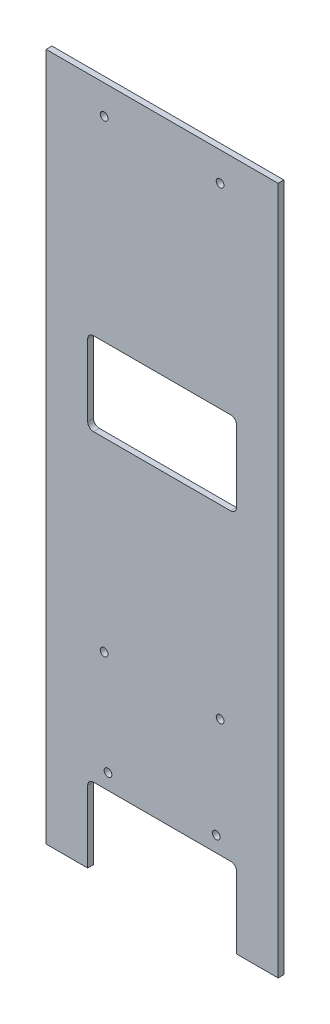
ISO-10303-21;
HEADER;
FILE_DESCRIPTION(('STEP AP214'),'2;1');
FILE_NAME('part.step','',(''),(''),'','','');
FILE_SCHEMA(('AUTOMOTIVE_DESIGN { 1 0 10303 214 1 1 1 1 }'));
ENDSEC;
DATA;
#1=APPLICATION_CONTEXT('core data for automotive mechanical design processes');
#2=APPLICATION_PROTOCOL_DEFINITION('international standard','automotive_design',2000,#1);
#3=PRODUCT_CONTEXT('',#1,'mechanical');
#4=PRODUCT('Part','Part','',(#3));
#5=PRODUCT_RELATED_PRODUCT_CATEGORY('part','',(#4));
#6=PRODUCT_DEFINITION_FORMATION('','',#4);
#7=PRODUCT_DEFINITION_CONTEXT('part definition',#1,'design');
#8=PRODUCT_DEFINITION('design','',#6,#7);
#9=PRODUCT_DEFINITION_SHAPE('','',#8);
#10=(LENGTH_UNIT() NAMED_UNIT(*) SI_UNIT(.MILLI.,.METRE.));
#11=(NAMED_UNIT(*) PLANE_ANGLE_UNIT() SI_UNIT($,.RADIAN.));
#12=(NAMED_UNIT(*) SI_UNIT($,.STERADIAN.) SOLID_ANGLE_UNIT());
#13=UNCERTAINTY_MEASURE_WITH_UNIT(LENGTH_MEASURE(1.E-05),#10,'distance_accuracy_value','');
#14=(GEOMETRIC_REPRESENTATION_CONTEXT(3) GLOBAL_UNCERTAINTY_ASSIGNED_CONTEXT((#13)) GLOBAL_UNIT_ASSIGNED_CONTEXT((#10,
#11,#12)) REPRESENTATION_CONTEXT('',''));
#15=CARTESIAN_POINT('',(0.,0.,0.));
#16=DIRECTION('',(0.,0.,1.));
#17=DIRECTION('',(1.,0.,0.));
#18=AXIS2_PLACEMENT_3D('',#15,#16,#17);
#19=CARTESIAN_POINT('',(-60.,-200.,3.));
#20=DIRECTION('',(1.,0.,0.));
#21=DIRECTION('',(0.,0.,-1.));
#22=AXIS2_PLACEMENT_3D('',#19,#20,#21);
#23=PLANE('',#22);
#24=DIRECTION('',(0.,-1.,0.));
#25=VECTOR('',#24,1.);
#26=CARTESIAN_POINT('',(-60.,-200.,0.));
#27=LINE('',#26,#25);
#28=CARTESIAN_POINT('',(-60.,200.,0.));
#29=VERTEX_POINT('',#28);
#30=CARTESIAN_POINT('',(-60.,-156.000000000003,0.));
#31=VERTEX_POINT('',#30);
#32=EDGE_CURVE('E187',#29,#31,#27,.T.);
#33=ORIENTED_EDGE('',*,*,#32,.T.);
#34=DIRECTION('',(0.,0.,1.));
#35=VECTOR('',#34,1.);
#36=CARTESIAN_POINT('',(-60.,-156.000000000003,-7.));
#37=LINE('',#36,#35);
#38=CARTESIAN_POINT('',(-60.,-156.000000000003,3.));
#39=VERTEX_POINT('',#38);
#40=EDGE_CURVE('E163',#31,#39,#37,.T.);
#41=ORIENTED_EDGE('',*,*,#40,.T.);
#42=DIRECTION('',(0.,-1.,0.));
#43=VECTOR('',#42,1.);
#44=CARTESIAN_POINT('',(-60.,-200.,3.));
#45=LINE('',#44,#43);
#46=CARTESIAN_POINT('',(-60.,200.,3.));
#47=VERTEX_POINT('',#46);
#48=EDGE_CURVE('E179',#47,#39,#45,.T.);
#49=ORIENTED_EDGE('',*,*,#48,.F.);
#50=DIRECTION('',(0.,0.,-1.));
#51=VECTOR('',#50,1.);
#52=CARTESIAN_POINT('',(-60.,200.,3.));
#53=LINE('',#52,#51);
#54=EDGE_CURVE('E40',#47,#29,#53,.T.);
#55=ORIENTED_EDGE('',*,*,#54,.T.);
#56=EDGE_LOOP('',(#33,#41,#49,#55));
#57=FACE_BOUND('',#56,.T.);
#58=ADVANCED_FACE('F32',(#57),#23,.F.);
#59=CARTESIAN_POINT('',(60.,-200.,3.));
#60=DIRECTION('',(-1.,0.,0.));
#61=DIRECTION('',(0.,0.,1.));
#62=AXIS2_PLACEMENT_3D('',#59,#60,#61);
#63=PLANE('',#62);
#64=DIRECTION('',(0.,1.,0.));
#65=VECTOR('',#64,1.);
#66=CARTESIAN_POINT('',(60.,-200.,3.));
#67=LINE('',#66,#65);
#68=CARTESIAN_POINT('',(60.,-156.000000000003,3.));
#69=VERTEX_POINT('',#68);
#70=CARTESIAN_POINT('',(60.,200.,3.));
#71=VERTEX_POINT('',#70);
#72=EDGE_CURVE('E169',#69,#71,#67,.T.);
#73=ORIENTED_EDGE('',*,*,#72,.F.);
#74=DIRECTION('',(0.,0.,1.));
#75=VECTOR('',#74,1.);
#76=CARTESIAN_POINT('',(60.,-156.000000000003,-7.));
#77=LINE('',#76,#75);
#78=CARTESIAN_POINT('',(60.,-156.000000000003,0.));
#79=VERTEX_POINT('',#78);
#80=EDGE_CURVE('E156',#79,#69,#77,.T.);
#81=ORIENTED_EDGE('',*,*,#80,.F.);
#82=DIRECTION('',(0.,1.,0.));
#83=VECTOR('',#82,1.);
#84=CARTESIAN_POINT('',(60.,-200.,0.));
#85=LINE('',#84,#83);
#86=CARTESIAN_POINT('',(60.,200.,0.));
#87=VERTEX_POINT('',#86);
#88=EDGE_CURVE('E190',#79,#87,#85,.T.);
#89=ORIENTED_EDGE('',*,*,#88,.T.);
#90=DIRECTION('',(0.,0.,-1.));
#91=VECTOR('',#90,1.);
#92=CARTESIAN_POINT('',(60.,200.,3.));
#93=LINE('',#92,#91);
#94=EDGE_CURVE('E11',#71,#87,#93,.T.);
#95=ORIENTED_EDGE('',*,*,#94,.F.);
#96=EDGE_LOOP('',(#73,#81,#89,#95));
#97=FACE_BOUND('',#96,.T.);
#98=ADVANCED_FACE('F176',(#97),#63,.F.);
#99=CARTESIAN_POINT('',(60.,200.,3.));
#100=DIRECTION('',(0.,-1.,0.));
#101=DIRECTION('',(0.,0.,-1.));
#102=AXIS2_PLACEMENT_3D('',#99,#100,#101);
#103=PLANE('',#102);
#104=DIRECTION('',(-1.,0.,0.));
#105=VECTOR('',#104,1.);
#106=CARTESIAN_POINT('',(60.,200.,0.));
#107=LINE('',#106,#105);
#108=EDGE_CURVE('E183',#87,#29,#107,.T.);
#109=ORIENTED_EDGE('',*,*,#108,.T.);
#110=ORIENTED_EDGE('',*,*,#54,.F.);
#111=DIRECTION('',(-1.,0.,0.));
#112=VECTOR('',#111,1.);
#113=CARTESIAN_POINT('',(60.,200.,3.));
#114=LINE('',#113,#112);
#115=EDGE_CURVE('E178',#71,#47,#114,.T.);
#116=ORIENTED_EDGE('',*,*,#115,.F.);
#117=ORIENTED_EDGE('',*,*,#94,.T.);
#118=EDGE_LOOP('',(#109,#110,#116,#117));
#119=FACE_BOUND('',#118,.T.);
#120=ADVANCED_FACE('F382',(#119),#103,.F.);
#121=CARTESIAN_POINT('',(0.,0.,3.));
#122=DIRECTION('',(0.,0.,1.));
#123=DIRECTION('',(1.,0.,0.));
#124=AXIS2_PLACEMENT_3D('',#121,#122,#123);
#125=PLANE('',#124);
#126=CARTESIAN_POINT('',(-28.,-108.000000000002,3.));
#127=DIRECTION('',(0.,0.,1.));
#128=DIRECTION('',(1.,0.,0.));
#129=AXIS2_PLACEMENT_3D('',#126,#127,#128);
#130=CIRCLE('',#129,2.);
#131=CARTESIAN_POINT('',(-26.,-108.000000000002,3.));
#132=VERTEX_POINT('',#131);
#133=EDGE_CURVE('E197',#132,#132,#130,.T.);
#134=ORIENTED_EDGE('',*,*,#133,.F.);
#135=EDGE_LOOP('',(#134));
#136=FACE_BOUND('',#135,.T.);
#137=CARTESIAN_POINT('',(28.,-108.000000000002,3.));
#138=DIRECTION('',(0.,0.,1.));
#139=DIRECTION('',(-1.,0.,0.));
#140=AXIS2_PLACEMENT_3D('',#137,#138,#139);
#141=CIRCLE('',#140,2.);
#142=CARTESIAN_POINT('',(26.,-108.000000000002,3.));
#143=VERTEX_POINT('',#142);
#144=EDGE_CURVE('E202',#143,#143,#141,.T.);
#145=ORIENTED_EDGE('',*,*,#144,.F.);
#146=EDGE_LOOP('',(#145));
#147=FACE_BOUND('',#146,.T.);
#148=DIRECTION('',(-1.,0.,0.));
#149=VECTOR('',#148,1.);
#150=CARTESIAN_POINT('',(-60.,-156.000000000003,3.));
#151=LINE('',#150,#149);
#152=CARTESIAN_POINT('',(38.5000000000035,-156.000000000003,3.));
#153=VERTEX_POINT('',#152);
#154=EDGE_CURVE('E48',#69,#153,#151,.T.);
#155=ORIENTED_EDGE('',*,*,#154,.F.);
#156=ORIENTED_EDGE('',*,*,#72,.T.);
#157=ORIENTED_EDGE('',*,*,#115,.T.);
#158=ORIENTED_EDGE('',*,*,#48,.T.);
#159=CARTESIAN_POINT('',(-38.4999999999965,-156.000000000003,3.));
#160=VERTEX_POINT('',#159);
#161=EDGE_CURVE('E174',#160,#39,#151,.T.);
#162=ORIENTED_EDGE('',*,*,#161,.F.);
#163=DIRECTION('',(0.,-1.,0.));
#164=VECTOR('',#163,1.);
#165=CARTESIAN_POINT('',(-38.4999999999946,-119.000000000002,3.));
#166=LINE('',#165,#164);
#167=CARTESIAN_POINT('',(-38.4999999999946,-119.000000000002,3.));
#168=VERTEX_POINT('',#167);
#169=EDGE_CURVE('E241',#168,#160,#166,.T.);
#170=ORIENTED_EDGE('',*,*,#169,.F.);
#171=CARTESIAN_POINT('',(-35.4999999999946,-119.000000000002,3.));
#172=DIRECTION('',(0.,0.,1.));
#173=DIRECTION('',(1.,0.,0.));
#174=AXIS2_PLACEMENT_3D('',#171,#172,#173);
#175=CIRCLE('',#174,3.);
#176=CARTESIAN_POINT('',(-35.4999999999946,-116.000000000002,3.));
#177=VERTEX_POINT('',#176);
#178=EDGE_CURVE('E262',#177,#168,#175,.T.);
#179=ORIENTED_EDGE('',*,*,#178,.F.);
#180=DIRECTION('',(-1.,0.,0.));
#181=VECTOR('',#180,1.);
#182=CARTESIAN_POINT('',(-35.4999999999946,-116.000000000002,3.));
#183=LINE('',#182,#181);
#184=CARTESIAN_POINT('',(35.5000000000054,-116.000000000002,3.));
#185=VERTEX_POINT('',#184);
#186=EDGE_CURVE('E259',#185,#177,#183,.T.);
#187=ORIENTED_EDGE('',*,*,#186,.F.);
#188=CARTESIAN_POINT('',(35.5000000000054,-119.000000000002,3.));
#189=DIRECTION('',(0.,0.,1.));
#190=DIRECTION('',(1.,0.,0.));
#191=AXIS2_PLACEMENT_3D('',#188,#189,#190);
#192=CIRCLE('',#191,3.);
#193=CARTESIAN_POINT('',(38.5000000000054,-119.000000000002,3.));
#194=VERTEX_POINT('',#193);
#195=EDGE_CURVE('E255',#194,#185,#192,.T.);
#196=ORIENTED_EDGE('',*,*,#195,.F.);
#197=DIRECTION('',(0.,1.,0.));
#198=VECTOR('',#197,1.);
#199=CARTESIAN_POINT('',(38.5000000000054,-119.000000000002,3.));
#200=LINE('',#199,#198);
#201=EDGE_CURVE('E173',#153,#194,#200,.T.);
#202=ORIENTED_EDGE('',*,*,#201,.F.);
#203=EDGE_LOOP('',(#155,#156,#157,#158,#162,#170,#179,#187,#196,#202));
#204=FACE_BOUND('',#203,.T.);
#205=CARTESIAN_POINT('',(-30.,-55.,3.));
#206=DIRECTION('',(0.,0.,1.));
#207=DIRECTION('',(1.,0.,0.));
#208=AXIS2_PLACEMENT_3D('',#205,#206,#207);
#209=CIRCLE('',#208,2.);
#210=CARTESIAN_POINT('',(-28.,-55.,3.));
#211=VERTEX_POINT('',#210);
#212=EDGE_CURVE('E216',#211,#211,#209,.T.);
#213=ORIENTED_EDGE('',*,*,#212,.F.);
#214=EDGE_LOOP('',(#213));
#215=FACE_BOUND('',#214,.T.);
#216=CARTESIAN_POINT('',(30.,-55.,3.));
#217=DIRECTION('',(0.,0.,1.));
#218=DIRECTION('',(-1.,0.,0.));
#219=AXIS2_PLACEMENT_3D('',#216,#217,#218);
#220=CIRCLE('',#219,2.);
#221=CARTESIAN_POINT('',(28.,-55.,3.));
#222=VERTEX_POINT('',#221);
#223=EDGE_CURVE('E217',#222,#222,#220,.T.);
#224=ORIENTED_EDGE('',*,*,#223,.F.);
#225=EDGE_LOOP('',(#224));
#226=FACE_BOUND('',#225,.T.);
#227=CARTESIAN_POINT('',(30.,185.,3.));
#228=DIRECTION('',(0.,0.,1.));
#229=DIRECTION('',(-1.,0.,0.));
#230=AXIS2_PLACEMENT_3D('',#227,#228,#229);
#231=CIRCLE('',#230,2.);
#232=CARTESIAN_POINT('',(28.,185.,3.));
#233=VERTEX_POINT('',#232);
#234=EDGE_CURVE('E223',#233,#233,#231,.T.);
#235=ORIENTED_EDGE('',*,*,#234,.F.);
#236=EDGE_LOOP('',(#235));
#237=FACE_BOUND('',#236,.T.);
#238=CARTESIAN_POINT('',(-30.,185.,3.));
#239=DIRECTION('',(0.,0.,1.));
#240=DIRECTION('',(1.,0.,0.));
#241=AXIS2_PLACEMENT_3D('',#238,#239,#240);
#242=CIRCLE('',#241,2.);
#243=CARTESIAN_POINT('',(-28.,185.,3.));
#244=VERTEX_POINT('',#243);
#245=EDGE_CURVE('E229',#244,#244,#242,.T.);
#246=ORIENTED_EDGE('',*,*,#245,.F.);
#247=EDGE_LOOP('',(#246));
#248=FACE_BOUND('',#247,.T.);
#249=CARTESIAN_POINT('',(35.5000000000035,43.9999999999969,3.));
#250=DIRECTION('',(0.,0.,1.));
#251=DIRECTION('',(1.,0.,0.));
#252=AXIS2_PLACEMENT_3D('',#249,#250,#251);
#253=CIRCLE('',#252,3.00000000000001);
#254=CARTESIAN_POINT('',(35.5000000000035,40.9999999999969,3.));
#255=VERTEX_POINT('',#254);
#256=CARTESIAN_POINT('',(38.5000000000035,43.9999999999969,3.));
#257=VERTEX_POINT('',#256);
#258=EDGE_CURVE('E56',#255,#257,#253,.T.);
#259=ORIENTED_EDGE('',*,*,#258,.F.);
#260=DIRECTION('',(1.,0.,0.));
#261=VECTOR('',#260,1.);
#262=CARTESIAN_POINT('',(-35.4999999999965,40.9999999999969,3.));
#263=LINE('',#262,#261);
#264=CARTESIAN_POINT('',(-35.4999999999965,40.9999999999969,3.));
#265=VERTEX_POINT('',#264);
#266=EDGE_CURVE('E281',#265,#255,#263,.T.);
#267=ORIENTED_EDGE('',*,*,#266,.F.);
#268=CARTESIAN_POINT('',(-35.4999999999965,43.9999999999969,3.));
#269=DIRECTION('',(0.,0.,1.));
#270=DIRECTION('',(-1.,0.,0.));
#271=AXIS2_PLACEMENT_3D('',#268,#269,#270);
#272=CIRCLE('',#271,3.00000000000001);
#273=CARTESIAN_POINT('',(-38.4999999999965,43.9999999999969,3.));
#274=VERTEX_POINT('',#273);
#275=EDGE_CURVE('E319',#274,#265,#272,.T.);
#276=ORIENTED_EDGE('',*,*,#275,.F.);
#277=DIRECTION('',(0.,-1.,0.));
#278=VECTOR('',#277,1.);
#279=CARTESIAN_POINT('',(-38.4999999999946,80.9999999999985,3.));
#280=LINE('',#279,#278);
#281=CARTESIAN_POINT('',(-38.4999999999946,80.9999999999985,3.));
#282=VERTEX_POINT('',#281);
#283=EDGE_CURVE('E316',#282,#274,#280,.T.);
#284=ORIENTED_EDGE('',*,*,#283,.F.);
#285=CARTESIAN_POINT('',(-35.4999999999946,80.9999999999985,3.));
#286=DIRECTION('',(0.,0.,1.));
#287=DIRECTION('',(1.,0.,0.));
#288=AXIS2_PLACEMENT_3D('',#285,#286,#287);
#289=CIRCLE('',#288,3.);
#290=CARTESIAN_POINT('',(-35.4999999999946,83.9999999999985,3.));
#291=VERTEX_POINT('',#290);
#292=EDGE_CURVE('E313',#291,#282,#289,.T.);
#293=ORIENTED_EDGE('',*,*,#292,.F.);
#294=DIRECTION('',(-1.,0.,0.));
#295=VECTOR('',#294,1.);
#296=CARTESIAN_POINT('',(-35.4999999999946,83.9999999999985,3.));
#297=LINE('',#296,#295);
#298=CARTESIAN_POINT('',(35.5000000000054,83.9999999999985,3.));
#299=VERTEX_POINT('',#298);
#300=EDGE_CURVE('E310',#299,#291,#297,.T.);
#301=ORIENTED_EDGE('',*,*,#300,.F.);
#302=CARTESIAN_POINT('',(35.5000000000054,80.9999999999985,3.));
#303=DIRECTION('',(0.,0.,1.));
#304=DIRECTION('',(1.,0.,0.));
#305=AXIS2_PLACEMENT_3D('',#302,#303,#304);
#306=CIRCLE('',#305,3.);
#307=CARTESIAN_POINT('',(38.5000000000054,80.9999999999985,3.));
#308=VERTEX_POINT('',#307);
#309=EDGE_CURVE('E307',#308,#299,#306,.T.);
#310=ORIENTED_EDGE('',*,*,#309,.F.);
#311=DIRECTION('',(0.,1.,0.));
#312=VECTOR('',#311,1.);
#313=CARTESIAN_POINT('',(38.5000000000054,80.9999999999985,3.));
#314=LINE('',#313,#312);
#315=EDGE_CURVE('E304',#257,#308,#314,.T.);
#316=ORIENTED_EDGE('',*,*,#315,.F.);
#317=EDGE_LOOP('',(#259,#267,#276,#284,#293,#301,#310,#316));
#318=FACE_BOUND('',#317,.T.);
#319=ADVANCED_FACE('F167',(#136,#147,#204,#215,#226,#237,#248,#318),#125,.T.);
#320=CARTESIAN_POINT('',(0.,0.,0.));
#321=DIRECTION('',(0.,0.,1.));
#322=DIRECTION('',(1.,0.,0.));
#323=AXIS2_PLACEMENT_3D('',#320,#321,#322);
#324=PLANE('',#323);
#325=CARTESIAN_POINT('',(-28.,-108.000000000002,0.));
#326=DIRECTION('',(0.,0.,1.));
#327=DIRECTION('',(1.,0.,0.));
#328=AXIS2_PLACEMENT_3D('',#325,#326,#327);
#329=CIRCLE('',#328,2.);
#330=CARTESIAN_POINT('',(-26.,-108.000000000002,0.));
#331=VERTEX_POINT('',#330);
#332=EDGE_CURVE('E35',#331,#331,#329,.T.);
#333=ORIENTED_EDGE('',*,*,#332,.T.);
#334=EDGE_LOOP('',(#333));
#335=FACE_BOUND('',#334,.T.);
#336=CARTESIAN_POINT('',(28.,-108.000000000002,0.));
#337=DIRECTION('',(0.,0.,1.));
#338=DIRECTION('',(1.,0.,0.));
#339=AXIS2_PLACEMENT_3D('',#336,#337,#338);
#340=CIRCLE('',#339,2.);
#341=CARTESIAN_POINT('',(30.,-108.000000000002,0.));
#342=VERTEX_POINT('',#341);
#343=EDGE_CURVE('E195',#342,#342,#340,.T.);
#344=ORIENTED_EDGE('',*,*,#343,.T.);
#345=EDGE_LOOP('',(#344));
#346=FACE_BOUND('',#345,.T.);
#347=CARTESIAN_POINT('',(-30.,-55.,0.));
#348=DIRECTION('',(0.,0.,1.));
#349=DIRECTION('',(1.,0.,0.));
#350=AXIS2_PLACEMENT_3D('',#347,#348,#349);
#351=CIRCLE('',#350,2.);
#352=CARTESIAN_POINT('',(-28.,-55.,0.));
#353=VERTEX_POINT('',#352);
#354=EDGE_CURVE('E226',#353,#353,#351,.T.);
#355=ORIENTED_EDGE('',*,*,#354,.T.);
#356=EDGE_LOOP('',(#355));
#357=FACE_BOUND('',#356,.T.);
#358=CARTESIAN_POINT('',(30.,-55.,0.));
#359=DIRECTION('',(0.,0.,1.));
#360=DIRECTION('',(-1.,0.,0.));
#361=AXIS2_PLACEMENT_3D('',#358,#359,#360);
#362=CIRCLE('',#361,2.);
#363=CARTESIAN_POINT('',(28.,-55.,0.));
#364=VERTEX_POINT('',#363);
#365=EDGE_CURVE('E213',#364,#364,#362,.T.);
#366=ORIENTED_EDGE('',*,*,#365,.T.);
#367=EDGE_LOOP('',(#366));
#368=FACE_BOUND('',#367,.T.);
#369=CARTESIAN_POINT('',(30.,185.,0.));
#370=DIRECTION('',(0.,0.,1.));
#371=DIRECTION('',(-1.,0.,0.));
#372=AXIS2_PLACEMENT_3D('',#369,#370,#371);
#373=CIRCLE('',#372,2.);
#374=CARTESIAN_POINT('',(28.,185.,0.));
#375=VERTEX_POINT('',#374);
#376=EDGE_CURVE('E220',#375,#375,#373,.T.);
#377=ORIENTED_EDGE('',*,*,#376,.T.);
#378=EDGE_LOOP('',(#377));
#379=FACE_BOUND('',#378,.T.);
#380=CARTESIAN_POINT('',(-30.,185.,0.));
#381=DIRECTION('',(0.,0.,1.));
#382=DIRECTION('',(1.,0.,0.));
#383=AXIS2_PLACEMENT_3D('',#380,#381,#382);
#384=CIRCLE('',#383,2.);
#385=CARTESIAN_POINT('',(-28.,185.,0.));
#386=VERTEX_POINT('',#385);
#387=EDGE_CURVE('E232',#386,#386,#384,.T.);
#388=ORIENTED_EDGE('',*,*,#387,.T.);
#389=EDGE_LOOP('',(#388));
#390=FACE_BOUND('',#389,.T.);
#391=ORIENTED_EDGE('',*,*,#88,.F.);
#392=DIRECTION('',(-1.,0.,0.));
#393=VECTOR('',#392,1.);
#394=CARTESIAN_POINT('',(0.,-156.000000000003,0.));
#395=LINE('',#394,#393);
#396=CARTESIAN_POINT('',(38.5000000000035,-156.000000000003,0.));
#397=VERTEX_POINT('',#396);
#398=EDGE_CURVE('E159',#79,#397,#395,.T.);
#399=ORIENTED_EDGE('',*,*,#398,.T.);
#400=DIRECTION('',(0.,1.,0.));
#401=VECTOR('',#400,1.);
#402=CARTESIAN_POINT('',(38.5000000000054,-119.000000000002,0.));
#403=LINE('',#402,#401);
#404=CARTESIAN_POINT('',(38.5000000000054,-119.000000000002,0.));
#405=VERTEX_POINT('',#404);
#406=EDGE_CURVE('E237',#397,#405,#403,.T.);
#407=ORIENTED_EDGE('',*,*,#406,.T.);
#408=CARTESIAN_POINT('',(35.5000000000054,-119.000000000002,0.));
#409=DIRECTION('',(0.,0.,1.));
#410=DIRECTION('',(1.,0.,0.));
#411=AXIS2_PLACEMENT_3D('',#408,#409,#410);
#412=CIRCLE('',#411,3.);
#413=CARTESIAN_POINT('',(35.5000000000054,-116.000000000002,0.));
#414=VERTEX_POINT('',#413);
#415=EDGE_CURVE('E240',#405,#414,#412,.T.);
#416=ORIENTED_EDGE('',*,*,#415,.T.);
#417=DIRECTION('',(-1.,0.,0.));
#418=VECTOR('',#417,1.);
#419=CARTESIAN_POINT('',(-35.4999999999946,-116.000000000002,0.));
#420=LINE('',#419,#418);
#421=CARTESIAN_POINT('',(-35.4999999999946,-116.000000000002,0.));
#422=VERTEX_POINT('',#421);
#423=EDGE_CURVE('E244',#414,#422,#420,.T.);
#424=ORIENTED_EDGE('',*,*,#423,.T.);
#425=CARTESIAN_POINT('',(-35.4999999999946,-119.000000000002,0.));
#426=DIRECTION('',(0.,0.,1.));
#427=DIRECTION('',(1.,0.,0.));
#428=AXIS2_PLACEMENT_3D('',#425,#426,#427);
#429=CIRCLE('',#428,3.);
#430=CARTESIAN_POINT('',(-38.4999999999946,-119.000000000002,0.));
#431=VERTEX_POINT('',#430);
#432=EDGE_CURVE('E247',#422,#431,#429,.T.);
#433=ORIENTED_EDGE('',*,*,#432,.T.);
#434=DIRECTION('',(0.,-1.,0.));
#435=VECTOR('',#434,1.);
#436=CARTESIAN_POINT('',(-38.4999999999946,-119.000000000002,0.));
#437=LINE('',#436,#435);
#438=CARTESIAN_POINT('',(-38.4999999999965,-156.000000000003,0.));
#439=VERTEX_POINT('',#438);
#440=EDGE_CURVE('E250',#431,#439,#437,.T.);
#441=ORIENTED_EDGE('',*,*,#440,.T.);
#442=EDGE_CURVE('E212',#439,#31,#395,.T.);
#443=ORIENTED_EDGE('',*,*,#442,.T.);
#444=ORIENTED_EDGE('',*,*,#32,.F.);
#445=ORIENTED_EDGE('',*,*,#108,.F.);
#446=EDGE_LOOP('',(#391,#399,#407,#416,#424,#433,#441,#443,#444,#445));
#447=FACE_BOUND('',#446,.T.);
#448=DIRECTION('',(1.,0.,0.));
#449=VECTOR('',#448,1.);
#450=CARTESIAN_POINT('',(-35.4999999999965,40.9999999999969,0.));
#451=LINE('',#450,#449);
#452=CARTESIAN_POINT('',(-35.4999999999965,40.9999999999969,0.));
#453=VERTEX_POINT('',#452);
#454=CARTESIAN_POINT('',(35.5000000000035,40.9999999999969,0.));
#455=VERTEX_POINT('',#454);
#456=EDGE_CURVE('E299',#453,#455,#451,.T.);
#457=ORIENTED_EDGE('',*,*,#456,.T.);
#458=CARTESIAN_POINT('',(35.5000000000035,43.9999999999969,0.));
#459=DIRECTION('',(0.,0.,1.));
#460=DIRECTION('',(1.,0.,0.));
#461=AXIS2_PLACEMENT_3D('',#458,#459,#460);
#462=CIRCLE('',#461,3.00000000000001);
#463=CARTESIAN_POINT('',(38.5000000000035,43.9999999999969,0.));
#464=VERTEX_POINT('',#463);
#465=EDGE_CURVE('E277',#455,#464,#462,.T.);
#466=ORIENTED_EDGE('',*,*,#465,.T.);
#467=DIRECTION('',(0.,1.,0.));
#468=VECTOR('',#467,1.);
#469=CARTESIAN_POINT('',(38.5000000000054,80.9999999999985,0.));
#470=LINE('',#469,#468);
#471=CARTESIAN_POINT('',(38.5000000000054,80.9999999999985,0.));
#472=VERTEX_POINT('',#471);
#473=EDGE_CURVE('E280',#464,#472,#470,.T.);
#474=ORIENTED_EDGE('',*,*,#473,.T.);
#475=CARTESIAN_POINT('',(35.5000000000054,80.9999999999985,0.));
#476=DIRECTION('',(0.,0.,1.));
#477=DIRECTION('',(1.,0.,0.));
#478=AXIS2_PLACEMENT_3D('',#475,#476,#477);
#479=CIRCLE('',#478,3.);
#480=CARTESIAN_POINT('',(35.5000000000054,83.9999999999985,0.));
#481=VERTEX_POINT('',#480);
#482=EDGE_CURVE('E284',#472,#481,#479,.T.);
#483=ORIENTED_EDGE('',*,*,#482,.T.);
#484=DIRECTION('',(-1.,0.,0.));
#485=VECTOR('',#484,1.);
#486=CARTESIAN_POINT('',(-35.4999999999946,83.9999999999985,0.));
#487=LINE('',#486,#485);
#488=CARTESIAN_POINT('',(-35.4999999999946,83.9999999999985,0.));
#489=VERTEX_POINT('',#488);
#490=EDGE_CURVE('E287',#481,#489,#487,.T.);
#491=ORIENTED_EDGE('',*,*,#490,.T.);
#492=CARTESIAN_POINT('',(-35.4999999999946,80.9999999999985,0.));
#493=DIRECTION('',(0.,0.,1.));
#494=DIRECTION('',(1.,0.,0.));
#495=AXIS2_PLACEMENT_3D('',#492,#493,#494);
#496=CIRCLE('',#495,3.);
#497=CARTESIAN_POINT('',(-38.4999999999946,80.9999999999985,0.));
#498=VERTEX_POINT('',#497);
#499=EDGE_CURVE('E290',#489,#498,#496,.T.);
#500=ORIENTED_EDGE('',*,*,#499,.T.);
#501=DIRECTION('',(0.,-1.,0.));
#502=VECTOR('',#501,1.);
#503=CARTESIAN_POINT('',(-38.4999999999946,80.9999999999985,0.));
#504=LINE('',#503,#502);
#505=CARTESIAN_POINT('',(-38.4999999999965,43.9999999999969,0.));
#506=VERTEX_POINT('',#505);
#507=EDGE_CURVE('E293',#498,#506,#504,.T.);
#508=ORIENTED_EDGE('',*,*,#507,.T.);
#509=CARTESIAN_POINT('',(-35.4999999999965,43.9999999999969,0.));
#510=DIRECTION('',(0.,0.,1.));
#511=DIRECTION('',(-1.,0.,0.));
#512=AXIS2_PLACEMENT_3D('',#509,#510,#511);
#513=CIRCLE('',#512,3.00000000000001);
#514=EDGE_CURVE('E296',#506,#453,#513,.T.);
#515=ORIENTED_EDGE('',*,*,#514,.T.);
#516=EDGE_LOOP('',(#457,#466,#474,#483,#491,#500,#508,#515));
#517=FACE_BOUND('',#516,.T.);
#518=ADVANCED_FACE('F351',(#335,#346,#357,#368,#379,#390,#447,#517),#324,.F.);
#519=CARTESIAN_POINT('',(35.5000000000035,43.9999999999969,0.));
#520=DIRECTION('',(0.,0.,1.));
#521=DIRECTION('',(1.,0.,0.));
#522=AXIS2_PLACEMENT_3D('',#519,#520,#521);
#523=CYLINDRICAL_SURFACE('',#522,3.00000000000001);
#524=ORIENTED_EDGE('',*,*,#258,.T.);
#525=DIRECTION('',(0.,0.,1.));
#526=VECTOR('',#525,1.);
#527=CARTESIAN_POINT('',(38.5000000000035,43.9999999999969,0.));
#528=LINE('',#527,#526);
#529=EDGE_CURVE('E302',#464,#257,#528,.T.);
#530=ORIENTED_EDGE('',*,*,#529,.F.);
#531=ORIENTED_EDGE('',*,*,#465,.F.);
#532=DIRECTION('',(0.,0.,1.));
#533=VECTOR('',#532,1.);
#534=CARTESIAN_POINT('',(35.5000000000035,40.9999999999969,0.));
#535=LINE('',#534,#533);
#536=EDGE_CURVE('E256',#455,#255,#535,.T.);
#537=ORIENTED_EDGE('',*,*,#536,.T.);
#538=EDGE_LOOP('',(#524,#530,#531,#537));
#539=FACE_BOUND('',#538,.T.);
#540=ADVANCED_FACE('F353',(#539),#523,.F.);
#541=CARTESIAN_POINT('',(-35.4999999999965,40.9999999999969,0.));
#542=DIRECTION('',(0.,-1.,0.));
#543=DIRECTION('',(0.,0.,-1.));
#544=AXIS2_PLACEMENT_3D('',#541,#542,#543);
#545=PLANE('',#544);
#546=ORIENTED_EDGE('',*,*,#266,.T.);
#547=ORIENTED_EDGE('',*,*,#536,.F.);
#548=ORIENTED_EDGE('',*,*,#456,.F.);
#549=DIRECTION('',(0.,0.,1.));
#550=VECTOR('',#549,1.);
#551=CARTESIAN_POINT('',(-35.4999999999965,40.9999999999969,0.));
#552=LINE('',#551,#550);
#553=EDGE_CURVE('E325',#453,#265,#552,.T.);
#554=ORIENTED_EDGE('',*,*,#553,.T.);
#555=EDGE_LOOP('',(#546,#547,#548,#554));
#556=FACE_BOUND('',#555,.T.);
#557=ADVANCED_FACE('F355',(#556),#545,.F.);
#558=CARTESIAN_POINT('',(-35.4999999999965,43.9999999999969,0.));
#559=DIRECTION('',(0.,0.,1.));
#560=DIRECTION('',(1.,0.,0.));
#561=AXIS2_PLACEMENT_3D('',#558,#559,#560);
#562=CYLINDRICAL_SURFACE('',#561,3.00000000000001);
#563=ORIENTED_EDGE('',*,*,#275,.T.);
#564=ORIENTED_EDGE('',*,*,#553,.F.);
#565=ORIENTED_EDGE('',*,*,#514,.F.);
#566=DIRECTION('',(0.,0.,1.));
#567=VECTOR('',#566,1.);
#568=CARTESIAN_POINT('',(-38.4999999999965,43.9999999999969,0.));
#569=LINE('',#568,#567);
#570=EDGE_CURVE('E327',#506,#274,#569,.T.);
#571=ORIENTED_EDGE('',*,*,#570,.T.);
#572=EDGE_LOOP('',(#563,#564,#565,#571));
#573=FACE_BOUND('',#572,.T.);
#574=ADVANCED_FACE('F359',(#573),#562,.F.);
#575=CARTESIAN_POINT('',(-38.4999999999946,80.9999999999985,0.));
#576=DIRECTION('',(-1.,0.,0.));
#577=DIRECTION('',(0.,-1.,0.));
#578=AXIS2_PLACEMENT_3D('',#575,#576,#577);
#579=PLANE('',#578);
#580=ORIENTED_EDGE('',*,*,#283,.T.);
#581=ORIENTED_EDGE('',*,*,#570,.F.);
#582=ORIENTED_EDGE('',*,*,#507,.F.);
#583=DIRECTION('',(0.,0.,1.));
#584=VECTOR('',#583,1.);
#585=CARTESIAN_POINT('',(-38.4999999999946,80.9999999999985,0.));
#586=LINE('',#585,#584);
#587=EDGE_CURVE('E329',#498,#282,#586,.T.);
#588=ORIENTED_EDGE('',*,*,#587,.T.);
#589=EDGE_LOOP('',(#580,#581,#582,#588));
#590=FACE_BOUND('',#589,.T.);
#591=ADVANCED_FACE('F363',(#590),#579,.F.);
#592=CARTESIAN_POINT('',(-35.4999999999946,80.9999999999985,0.));
#593=DIRECTION('',(0.,0.,1.));
#594=DIRECTION('',(1.,0.,0.));
#595=AXIS2_PLACEMENT_3D('',#592,#593,#594);
#596=CYLINDRICAL_SURFACE('',#595,3.);
#597=ORIENTED_EDGE('',*,*,#292,.T.);
#598=ORIENTED_EDGE('',*,*,#587,.F.);
#599=ORIENTED_EDGE('',*,*,#499,.F.);
#600=DIRECTION('',(0.,0.,1.));
#601=VECTOR('',#600,1.);
#602=CARTESIAN_POINT('',(-35.4999999999946,83.9999999999985,0.));
#603=LINE('',#602,#601);
#604=EDGE_CURVE('E331',#489,#291,#603,.T.);
#605=ORIENTED_EDGE('',*,*,#604,.T.);
#606=EDGE_LOOP('',(#597,#598,#599,#605));
#607=FACE_BOUND('',#606,.T.);
#608=ADVANCED_FACE('F366',(#607),#596,.F.);
#609=CARTESIAN_POINT('',(-35.4999999999946,83.9999999999985,0.));
#610=DIRECTION('',(0.,1.,0.));
#611=DIRECTION('',(0.,0.,1.));
#612=AXIS2_PLACEMENT_3D('',#609,#610,#611);
#613=PLANE('',#612);
#614=ORIENTED_EDGE('',*,*,#300,.T.);
#615=ORIENTED_EDGE('',*,*,#604,.F.);
#616=ORIENTED_EDGE('',*,*,#490,.F.);
#617=DIRECTION('',(0.,0.,1.));
#618=VECTOR('',#617,1.);
#619=CARTESIAN_POINT('',(35.5000000000054,83.9999999999985,0.));
#620=LINE('',#619,#618);
#621=EDGE_CURVE('E333',#481,#299,#620,.T.);
#622=ORIENTED_EDGE('',*,*,#621,.T.);
#623=EDGE_LOOP('',(#614,#615,#616,#622));
#624=FACE_BOUND('',#623,.T.);
#625=ADVANCED_FACE('F368',(#624),#613,.F.);
#626=CARTESIAN_POINT('',(35.5000000000054,80.9999999999985,0.));
#627=DIRECTION('',(0.,0.,1.));
#628=DIRECTION('',(1.,0.,0.));
#629=AXIS2_PLACEMENT_3D('',#626,#627,#628);
#630=CYLINDRICAL_SURFACE('',#629,3.);
#631=ORIENTED_EDGE('',*,*,#309,.T.);
#632=ORIENTED_EDGE('',*,*,#621,.F.);
#633=ORIENTED_EDGE('',*,*,#482,.F.);
#634=DIRECTION('',(0.,0.,1.));
#635=VECTOR('',#634,1.);
#636=CARTESIAN_POINT('',(38.5000000000054,80.9999999999985,0.));
#637=LINE('',#636,#635);
#638=EDGE_CURVE('E335',#472,#308,#637,.T.);
#639=ORIENTED_EDGE('',*,*,#638,.T.);
#640=EDGE_LOOP('',(#631,#632,#633,#639));
#641=FACE_BOUND('',#640,.T.);
#642=ADVANCED_FACE('F348',(#641),#630,.F.);
#643=CARTESIAN_POINT('',(38.5000000000054,80.9999999999985,0.));
#644=DIRECTION('',(1.,0.,0.));
#645=DIRECTION('',(0.,1.,0.));
#646=AXIS2_PLACEMENT_3D('',#643,#644,#645);
#647=PLANE('',#646);
#648=ORIENTED_EDGE('',*,*,#315,.T.);
#649=ORIENTED_EDGE('',*,*,#638,.F.);
#650=ORIENTED_EDGE('',*,*,#473,.F.);
#651=ORIENTED_EDGE('',*,*,#529,.T.);
#652=EDGE_LOOP('',(#648,#649,#650,#651));
#653=FACE_BOUND('',#652,.T.);
#654=ADVANCED_FACE('F339',(#653),#647,.F.);
#655=CARTESIAN_POINT('',(-38.4999999999946,-119.000000000002,0.));
#656=DIRECTION('',(-1.,0.,0.));
#657=DIRECTION('',(0.,-1.,0.));
#658=AXIS2_PLACEMENT_3D('',#655,#656,#657);
#659=PLANE('',#658);
#660=ORIENTED_EDGE('',*,*,#169,.T.);
#661=DIRECTION('',(0.,0.,1.));
#662=VECTOR('',#661,1.);
#663=CARTESIAN_POINT('',(-38.4999999999965,-156.000000000003,0.));
#664=LINE('',#663,#662);
#665=EDGE_CURVE('E191',#439,#160,#664,.T.);
#666=ORIENTED_EDGE('',*,*,#665,.F.);
#667=ORIENTED_EDGE('',*,*,#440,.F.);
#668=DIRECTION('',(0.,0.,1.));
#669=VECTOR('',#668,1.);
#670=CARTESIAN_POINT('',(-38.4999999999946,-119.000000000002,0.));
#671=LINE('',#670,#669);
#672=EDGE_CURVE('E268',#431,#168,#671,.T.);
#673=ORIENTED_EDGE('',*,*,#672,.T.);
#674=EDGE_LOOP('',(#660,#666,#667,#673));
#675=FACE_BOUND('',#674,.T.);
#676=ADVANCED_FACE('F395',(#675),#659,.F.);
#677=CARTESIAN_POINT('',(-35.4999999999946,-119.000000000002,0.));
#678=DIRECTION('',(0.,0.,1.));
#679=DIRECTION('',(1.,0.,0.));
#680=AXIS2_PLACEMENT_3D('',#677,#678,#679);
#681=CYLINDRICAL_SURFACE('',#680,3.);
#682=ORIENTED_EDGE('',*,*,#178,.T.);
#683=ORIENTED_EDGE('',*,*,#672,.F.);
#684=ORIENTED_EDGE('',*,*,#432,.F.);
#685=DIRECTION('',(0.,0.,1.));
#686=VECTOR('',#685,1.);
#687=CARTESIAN_POINT('',(-35.4999999999946,-116.000000000002,0.));
#688=LINE('',#687,#686);
#689=EDGE_CURVE('E270',#422,#177,#688,.T.);
#690=ORIENTED_EDGE('',*,*,#689,.T.);
#691=EDGE_LOOP('',(#682,#683,#684,#690));
#692=FACE_BOUND('',#691,.T.);
#693=ADVANCED_FACE('F417',(#692),#681,.F.);
#694=CARTESIAN_POINT('',(-35.4999999999946,-116.000000000002,0.));
#695=DIRECTION('',(0.,1.,0.));
#696=DIRECTION('',(0.,0.,1.));
#697=AXIS2_PLACEMENT_3D('',#694,#695,#696);
#698=PLANE('',#697);
#699=ORIENTED_EDGE('',*,*,#186,.T.);
#700=ORIENTED_EDGE('',*,*,#689,.F.);
#701=ORIENTED_EDGE('',*,*,#423,.F.);
#702=DIRECTION('',(0.,0.,1.));
#703=VECTOR('',#702,1.);
#704=CARTESIAN_POINT('',(35.5000000000054,-116.000000000002,0.));
#705=LINE('',#704,#703);
#706=EDGE_CURVE('E272',#414,#185,#705,.T.);
#707=ORIENTED_EDGE('',*,*,#706,.T.);
#708=EDGE_LOOP('',(#699,#700,#701,#707));
#709=FACE_BOUND('',#708,.T.);
#710=ADVANCED_FACE('F422',(#709),#698,.F.);
#711=CARTESIAN_POINT('',(35.5000000000054,-119.000000000002,0.));
#712=DIRECTION('',(0.,0.,1.));
#713=DIRECTION('',(1.,0.,0.));
#714=AXIS2_PLACEMENT_3D('',#711,#712,#713);
#715=CYLINDRICAL_SURFACE('',#714,3.);
#716=ORIENTED_EDGE('',*,*,#195,.T.);
#717=ORIENTED_EDGE('',*,*,#706,.F.);
#718=ORIENTED_EDGE('',*,*,#415,.F.);
#719=DIRECTION('',(0.,0.,1.));
#720=VECTOR('',#719,1.);
#721=CARTESIAN_POINT('',(38.5000000000054,-119.000000000002,0.));
#722=LINE('',#721,#720);
#723=EDGE_CURVE('E274',#405,#194,#722,.T.);
#724=ORIENTED_EDGE('',*,*,#723,.T.);
#725=EDGE_LOOP('',(#716,#717,#718,#724));
#726=FACE_BOUND('',#725,.T.);
#727=ADVANCED_FACE('F431',(#726),#715,.F.);
#728=CARTESIAN_POINT('',(38.5000000000054,-119.000000000002,0.));
#729=DIRECTION('',(1.,0.,0.));
#730=DIRECTION('',(0.,1.,0.));
#731=AXIS2_PLACEMENT_3D('',#728,#729,#730);
#732=PLANE('',#731);
#733=ORIENTED_EDGE('',*,*,#201,.T.);
#734=ORIENTED_EDGE('',*,*,#723,.F.);
#735=ORIENTED_EDGE('',*,*,#406,.F.);
#736=DIRECTION('',(0.,0.,1.));
#737=VECTOR('',#736,1.);
#738=CARTESIAN_POINT('',(38.5000000000035,-156.000000000003,0.));
#739=LINE('',#738,#737);
#740=EDGE_CURVE('E253',#397,#153,#739,.T.);
#741=ORIENTED_EDGE('',*,*,#740,.T.);
#742=EDGE_LOOP('',(#733,#734,#735,#741));
#743=FACE_BOUND('',#742,.T.);
#744=ADVANCED_FACE('F435',(#743),#732,.F.);
#745=CARTESIAN_POINT('',(-30.,185.,0.));
#746=DIRECTION('',(0.,0.,1.));
#747=DIRECTION('',(1.,0.,0.));
#748=AXIS2_PLACEMENT_3D('',#745,#746,#747);
#749=CYLINDRICAL_SURFACE('',#748,2.);
#750=ORIENTED_EDGE('',*,*,#387,.F.);
#751=EDGE_LOOP('',(#750));
#752=FACE_BOUND('',#751,.T.);
#753=ORIENTED_EDGE('',*,*,#245,.T.);
#754=EDGE_LOOP('',(#753));
#755=FACE_BOUND('',#754,.T.);
#756=ADVANCED_FACE('F426',(#752,#755),#749,.F.);
#757=CARTESIAN_POINT('',(30.,185.,0.));
#758=DIRECTION('',(0.,0.,1.));
#759=DIRECTION('',(1.,0.,0.));
#760=AXIS2_PLACEMENT_3D('',#757,#758,#759);
#761=CYLINDRICAL_SURFACE('',#760,2.);
#762=ORIENTED_EDGE('',*,*,#376,.F.);
#763=EDGE_LOOP('',(#762));
#764=FACE_BOUND('',#763,.T.);
#765=ORIENTED_EDGE('',*,*,#234,.T.);
#766=EDGE_LOOP('',(#765));
#767=FACE_BOUND('',#766,.T.);
#768=ADVANCED_FACE('F496',(#764,#767),#761,.F.);
#769=CARTESIAN_POINT('',(30.,-55.,0.));
#770=DIRECTION('',(0.,0.,1.));
#771=DIRECTION('',(1.,0.,0.));
#772=AXIS2_PLACEMENT_3D('',#769,#770,#771);
#773=CYLINDRICAL_SURFACE('',#772,2.);
#774=ORIENTED_EDGE('',*,*,#365,.F.);
#775=EDGE_LOOP('',(#774));
#776=FACE_BOUND('',#775,.T.);
#777=ORIENTED_EDGE('',*,*,#223,.T.);
#778=EDGE_LOOP('',(#777));
#779=FACE_BOUND('',#778,.T.);
#780=ADVANCED_FACE('F505',(#776,#779),#773,.F.);
#781=CARTESIAN_POINT('',(-30.,-55.,0.));
#782=DIRECTION('',(0.,0.,1.));
#783=DIRECTION('',(1.,0.,0.));
#784=AXIS2_PLACEMENT_3D('',#781,#782,#783);
#785=CYLINDRICAL_SURFACE('',#784,2.);
#786=ORIENTED_EDGE('',*,*,#354,.F.);
#787=EDGE_LOOP('',(#786));
#788=FACE_BOUND('',#787,.T.);
#789=ORIENTED_EDGE('',*,*,#212,.T.);
#790=EDGE_LOOP('',(#789));
#791=FACE_BOUND('',#790,.T.);
#792=ADVANCED_FACE('F515',(#788,#791),#785,.F.);
#793=CARTESIAN_POINT('',(-60.,-156.000000000003,-7.));
#794=DIRECTION('',(0.,1.,0.));
#795=DIRECTION('',(0.,0.,1.));
#796=AXIS2_PLACEMENT_3D('',#793,#794,#795);
#797=PLANE('',#796);
#798=ORIENTED_EDGE('',*,*,#80,.T.);
#799=ORIENTED_EDGE('',*,*,#154,.T.);
#800=ORIENTED_EDGE('',*,*,#740,.F.);
#801=ORIENTED_EDGE('',*,*,#398,.F.);
#802=EDGE_LOOP('',(#798,#799,#800,#801));
#803=FACE_BOUND('',#802,.T.);
#804=ADVANCED_FACE('F157',(#803),#797,.F.);
#805=ORIENTED_EDGE('',*,*,#665,.T.);
#806=ORIENTED_EDGE('',*,*,#161,.T.);
#807=ORIENTED_EDGE('',*,*,#40,.F.);
#808=ORIENTED_EDGE('',*,*,#442,.F.);
#809=EDGE_LOOP('',(#805,#806,#807,#808));
#810=FACE_BOUND('',#809,.T.);
#811=ADVANCED_FACE('F392',(#810),#797,.F.);
#812=CARTESIAN_POINT('',(28.,-108.000000000002,-7.));
#813=DIRECTION('',(0.,0.,1.));
#814=DIRECTION('',(1.,0.,0.));
#815=AXIS2_PLACEMENT_3D('',#812,#813,#814);
#816=CYLINDRICAL_SURFACE('',#815,2.);
#817=ORIENTED_EDGE('',*,*,#144,.T.);
#818=EDGE_LOOP('',(#817));
#819=FACE_BOUND('',#818,.T.);
#820=ORIENTED_EDGE('',*,*,#343,.F.);
#821=EDGE_LOOP('',(#820));
#822=FACE_BOUND('',#821,.T.);
#823=ADVANCED_FACE('F560',(#819,#822),#816,.F.);
#824=CARTESIAN_POINT('',(-28.,-108.000000000002,-7.));
#825=DIRECTION('',(0.,0.,1.));
#826=DIRECTION('',(1.,0.,0.));
#827=AXIS2_PLACEMENT_3D('',#824,#825,#826);
#828=CYLINDRICAL_SURFACE('',#827,2.);
#829=ORIENTED_EDGE('',*,*,#133,.T.);
#830=EDGE_LOOP('',(#829));
#831=FACE_BOUND('',#830,.T.);
#832=ORIENTED_EDGE('',*,*,#332,.F.);
#833=EDGE_LOOP('',(#832));
#834=FACE_BOUND('',#833,.T.);
#835=ADVANCED_FACE('F581',(#831,#834),#828,.F.);
#836=CLOSED_SHELL('',(#58,#98,#120,#319,#518,#540,#557,#574,#591,#608,#625,#642,#654,#676,#693,
#710,#727,#744,#756,#768,#780,#792,#804,#811,#823,#835));
#837=MANIFOLD_SOLID_BREP('B2',#836);
#838=ADVANCED_BREP_SHAPE_REPRESENTATION('',(#18,#837),#14);
#839=SHAPE_DEFINITION_REPRESENTATION(#9,#838);
ENDSEC;
END-ISO-10303-21;
